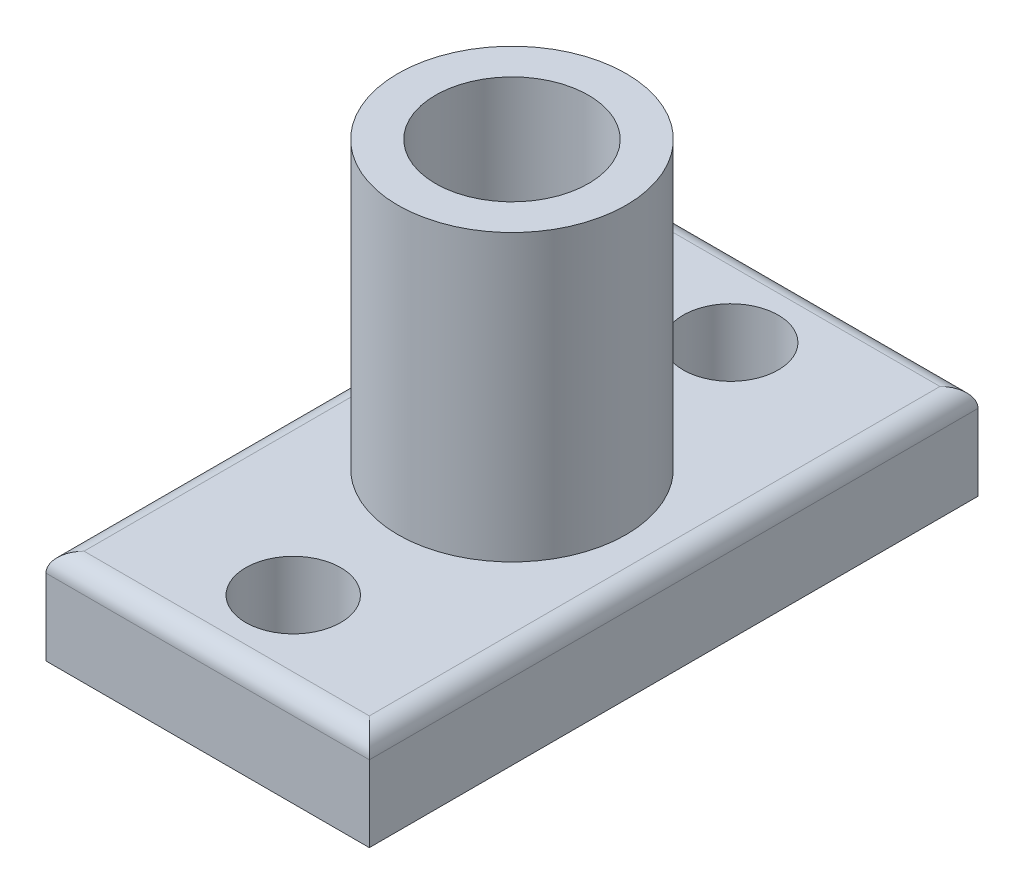
ISO-10303-21;
HEADER;
FILE_DESCRIPTION(('STEP AP214'),'2;1');
FILE_NAME('part.step','',(''),(''),'','','');
FILE_SCHEMA(('AUTOMOTIVE_DESIGN { 1 0 10303 214 1 1 1 1 }'));
ENDSEC;
DATA;
#1=APPLICATION_CONTEXT('core data for automotive mechanical design processes');
#2=APPLICATION_PROTOCOL_DEFINITION('international standard','automotive_design',2000,#1);
#3=PRODUCT_CONTEXT('',#1,'mechanical');
#4=PRODUCT('Part','Part','',(#3));
#5=PRODUCT_RELATED_PRODUCT_CATEGORY('part','',(#4));
#6=PRODUCT_DEFINITION_FORMATION('','',#4);
#7=PRODUCT_DEFINITION_CONTEXT('part definition',#1,'design');
#8=PRODUCT_DEFINITION('design','',#6,#7);
#9=PRODUCT_DEFINITION_SHAPE('','',#8);
#10=(LENGTH_UNIT() NAMED_UNIT(*) SI_UNIT(.MILLI.,.METRE.));
#11=(NAMED_UNIT(*) PLANE_ANGLE_UNIT() SI_UNIT($,.RADIAN.));
#12=(NAMED_UNIT(*) SI_UNIT($,.STERADIAN.) SOLID_ANGLE_UNIT());
#13=UNCERTAINTY_MEASURE_WITH_UNIT(LENGTH_MEASURE(1.E-05),#10,'distance_accuracy_value','');
#14=(GEOMETRIC_REPRESENTATION_CONTEXT(3) GLOBAL_UNCERTAINTY_ASSIGNED_CONTEXT((#13)) GLOBAL_UNIT_ASSIGNED_CONTEXT((#10,
#11,#12)) REPRESENTATION_CONTEXT('',''));
#15=CARTESIAN_POINT('',(0.,0.,0.));
#16=DIRECTION('',(0.,0.,1.));
#17=DIRECTION('',(1.,0.,0.));
#18=AXIS2_PLACEMENT_3D('',#15,#16,#17);
#19=CARTESIAN_POINT('',(0.,5.,0.));
#20=DIRECTION('',(0.,-1.,0.));
#21=DIRECTION('',(0.,0.,-1.));
#22=AXIS2_PLACEMENT_3D('',#19,#20,#21);
#23=PLANE('',#22);
#24=DIRECTION('',(-1.,0.,0.));
#25=VECTOR('',#24,1.);
#26=CARTESIAN_POINT('',(0.,5.,-15.));
#27=LINE('',#26,#25);
#28=CARTESIAN_POINT('',(7.5,5.,-15.));
#29=VERTEX_POINT('',#28);
#30=CARTESIAN_POINT('',(-7.5,5.,-15.));
#31=VERTEX_POINT('',#30);
#32=EDGE_CURVE('E150',#29,#31,#27,.T.);
#33=ORIENTED_EDGE('',*,*,#32,.T.);
#34=DIRECTION('',(0.,0.,1.));
#35=VECTOR('',#34,1.);
#36=CARTESIAN_POINT('',(-7.5,5.,0.));
#37=LINE('',#36,#35);
#38=CARTESIAN_POINT('',(-7.5,5.,15.));
#39=VERTEX_POINT('',#38);
#40=EDGE_CURVE('E154',#31,#39,#37,.T.);
#41=ORIENTED_EDGE('',*,*,#40,.T.);
#42=DIRECTION('',(1.,0.,0.));
#43=VECTOR('',#42,1.);
#44=CARTESIAN_POINT('',(0.,5.,15.));
#45=LINE('',#44,#43);
#46=CARTESIAN_POINT('',(7.5,5.,15.));
#47=VERTEX_POINT('',#46);
#48=EDGE_CURVE('E147',#39,#47,#45,.T.);
#49=ORIENTED_EDGE('',*,*,#48,.T.);
#50=DIRECTION('',(0.,0.,-1.));
#51=VECTOR('',#50,1.);
#52=CARTESIAN_POINT('',(7.5,5.,0.));
#53=LINE('',#52,#51);
#54=EDGE_CURVE('E144',#47,#29,#53,.T.);
#55=ORIENTED_EDGE('',*,*,#54,.T.);
#56=EDGE_LOOP('',(#33,#41,#49,#55));
#57=FACE_BOUND('',#56,.T.);
#58=CARTESIAN_POINT('',(0.,5.,0.));
#59=DIRECTION('',(0.,-1.,0.));
#60=DIRECTION('',(0.,0.,-1.));
#61=AXIS2_PLACEMENT_3D('',#58,#59,#60);
#62=CIRCLE('',#61,6.);
#63=CARTESIAN_POINT('',(0.,5.,-6.));
#64=VERTEX_POINT('',#63);
#65=EDGE_CURVE('E104',#64,#64,#62,.F.);
#66=ORIENTED_EDGE('',*,*,#65,.F.);
#67=EDGE_LOOP('',(#66));
#68=FACE_BOUND('',#67,.T.);
#69=CARTESIAN_POINT('',(0.,5.,-11.5));
#70=DIRECTION('',(0.,1.,0.));
#71=DIRECTION('',(0.,0.,1.));
#72=AXIS2_PLACEMENT_3D('',#69,#70,#71);
#73=CIRCLE('',#72,2.5);
#74=CARTESIAN_POINT('',(0.,5.,-9.));
#75=VERTEX_POINT('',#74);
#76=EDGE_CURVE('E121',#75,#75,#73,.T.);
#77=ORIENTED_EDGE('',*,*,#76,.F.);
#78=EDGE_LOOP('',(#77));
#79=FACE_BOUND('',#78,.T.);
#80=CARTESIAN_POINT('',(0.,5.,11.5));
#81=DIRECTION('',(0.,1.,0.));
#82=DIRECTION('',(0.,0.,1.));
#83=AXIS2_PLACEMENT_3D('',#80,#81,#82);
#84=CIRCLE('',#83,2.5);
#85=CARTESIAN_POINT('',(0.,5.,14.));
#86=VERTEX_POINT('',#85);
#87=EDGE_CURVE('E196',#86,#86,#84,.T.);
#88=ORIENTED_EDGE('',*,*,#87,.F.);
#89=EDGE_LOOP('',(#88));
#90=FACE_BOUND('',#89,.T.);
#91=ADVANCED_FACE('F39',(#57,#68,#79,#90),#23,.F.);
#92=CARTESIAN_POINT('',(0.,0.,0.));
#93=DIRECTION('',(0.,-1.,0.));
#94=DIRECTION('',(0.,0.,-1.));
#95=AXIS2_PLACEMENT_3D('',#92,#93,#94);
#96=PLANE('',#95);
#97=CARTESIAN_POINT('',(0.,0.,-11.5));
#98=DIRECTION('',(0.,1.,0.));
#99=DIRECTION('',(0.,0.,1.));
#100=AXIS2_PLACEMENT_3D('',#97,#98,#99);
#101=CIRCLE('',#100,2.5);
#102=CARTESIAN_POINT('',(0.,0.,-9.));
#103=VERTEX_POINT('',#102);
#104=EDGE_CURVE('E125',#103,#103,#101,.T.);
#105=ORIENTED_EDGE('',*,*,#104,.T.);
#106=EDGE_LOOP('',(#105));
#107=FACE_BOUND('',#106,.T.);
#108=DIRECTION('',(0.,0.,-1.));
#109=VECTOR('',#108,1.);
#110=CARTESIAN_POINT('',(8.5,0.,16.));
#111=LINE('',#110,#109);
#112=CARTESIAN_POINT('',(8.5,0.,16.));
#113=VERTEX_POINT('',#112);
#114=CARTESIAN_POINT('',(8.5,0.,-16.));
#115=VERTEX_POINT('',#114);
#116=EDGE_CURVE('E112',#113,#115,#111,.T.);
#117=ORIENTED_EDGE('',*,*,#116,.F.);
#118=DIRECTION('',(1.,0.,0.));
#119=VECTOR('',#118,1.);
#120=CARTESIAN_POINT('',(-8.5,0.,16.));
#121=LINE('',#120,#119);
#122=CARTESIAN_POINT('',(-8.5,0.,16.));
#123=VERTEX_POINT('',#122);
#124=EDGE_CURVE('E131',#123,#113,#121,.T.);
#125=ORIENTED_EDGE('',*,*,#124,.F.);
#126=DIRECTION('',(0.,0.,1.));
#127=VECTOR('',#126,1.);
#128=CARTESIAN_POINT('',(-8.5,0.,16.));
#129=LINE('',#128,#127);
#130=CARTESIAN_POINT('',(-8.5,0.,-16.));
#131=VERTEX_POINT('',#130);
#132=EDGE_CURVE('E114',#131,#123,#129,.T.);
#133=ORIENTED_EDGE('',*,*,#132,.F.);
#134=DIRECTION('',(-1.,0.,0.));
#135=VECTOR('',#134,1.);
#136=CARTESIAN_POINT('',(-8.5,0.,-16.));
#137=LINE('',#136,#135);
#138=EDGE_CURVE('E98',#115,#131,#137,.T.);
#139=ORIENTED_EDGE('',*,*,#138,.F.);
#140=EDGE_LOOP('',(#117,#125,#133,#139));
#141=FACE_BOUND('',#140,.T.);
#142=CARTESIAN_POINT('',(0.,0.,11.5));
#143=DIRECTION('',(0.,1.,0.));
#144=DIRECTION('',(0.,0.,1.));
#145=AXIS2_PLACEMENT_3D('',#142,#143,#144);
#146=CIRCLE('',#145,2.5);
#147=CARTESIAN_POINT('',(0.,0.,14.));
#148=VERTEX_POINT('',#147);
#149=EDGE_CURVE('E195',#148,#148,#146,.T.);
#150=ORIENTED_EDGE('',*,*,#149,.T.);
#151=EDGE_LOOP('',(#150));
#152=FACE_BOUND('',#151,.T.);
#153=ADVANCED_FACE('F109',(#107,#141,#152),#96,.T.);
#154=CARTESIAN_POINT('',(8.5,5.,16.));
#155=DIRECTION('',(-1.,0.,0.));
#156=DIRECTION('',(0.,0.,1.));
#157=AXIS2_PLACEMENT_3D('',#154,#155,#156);
#158=PLANE('',#157);
#159=DIRECTION('',(0.,-1.,0.));
#160=VECTOR('',#159,1.);
#161=CARTESIAN_POINT('',(8.5,5.,-16.));
#162=LINE('',#161,#160);
#163=CARTESIAN_POINT('',(8.5,4.,-16.));
#164=VERTEX_POINT('',#163);
#165=EDGE_CURVE('E94',#164,#115,#162,.T.);
#166=ORIENTED_EDGE('',*,*,#165,.F.);
#167=DIRECTION('',(0.,0.,-1.));
#168=VECTOR('',#167,1.);
#169=CARTESIAN_POINT('',(8.5,4.,16.));
#170=LINE('',#169,#168);
#171=CARTESIAN_POINT('',(8.5,4.,16.));
#172=VERTEX_POINT('',#171);
#173=EDGE_CURVE('E11',#164,#172,#170,.F.);
#174=ORIENTED_EDGE('',*,*,#173,.T.);
#175=DIRECTION('',(0.,-1.,0.));
#176=VECTOR('',#175,1.);
#177=CARTESIAN_POINT('',(8.5,5.,16.));
#178=LINE('',#177,#176);
#179=EDGE_CURVE('E118',#172,#113,#178,.T.);
#180=ORIENTED_EDGE('',*,*,#179,.T.);
#181=ORIENTED_EDGE('',*,*,#116,.T.);
#182=EDGE_LOOP('',(#166,#174,#180,#181));
#183=FACE_BOUND('',#182,.T.);
#184=ADVANCED_FACE('F117',(#183),#158,.F.);
#185=CARTESIAN_POINT('',(-8.5,5.,-16.));
#186=DIRECTION('',(0.,0.,1.));
#187=DIRECTION('',(1.,0.,0.));
#188=AXIS2_PLACEMENT_3D('',#185,#186,#187);
#189=PLANE('',#188);
#190=DIRECTION('',(0.,-1.,0.));
#191=VECTOR('',#190,1.);
#192=CARTESIAN_POINT('',(-8.5,5.,-16.));
#193=LINE('',#192,#191);
#194=CARTESIAN_POINT('',(-8.5,4.,-16.));
#195=VERTEX_POINT('',#194);
#196=EDGE_CURVE('E105',#195,#131,#193,.T.);
#197=ORIENTED_EDGE('',*,*,#196,.F.);
#198=DIRECTION('',(-1.,0.,0.));
#199=VECTOR('',#198,1.);
#200=CARTESIAN_POINT('',(-8.5,4.,-16.));
#201=LINE('',#200,#199);
#202=EDGE_CURVE('E101',#195,#164,#201,.F.);
#203=ORIENTED_EDGE('',*,*,#202,.T.);
#204=ORIENTED_EDGE('',*,*,#165,.T.);
#205=ORIENTED_EDGE('',*,*,#138,.T.);
#206=EDGE_LOOP('',(#197,#203,#204,#205));
#207=FACE_BOUND('',#206,.T.);
#208=ADVANCED_FACE('F97',(#207),#189,.F.);
#209=CARTESIAN_POINT('',(-8.5,5.,16.));
#210=DIRECTION('',(1.,0.,0.));
#211=DIRECTION('',(0.,0.,-1.));
#212=AXIS2_PLACEMENT_3D('',#209,#210,#211);
#213=PLANE('',#212);
#214=DIRECTION('',(0.,-1.,0.));
#215=VECTOR('',#214,1.);
#216=CARTESIAN_POINT('',(-8.5,5.,16.));
#217=LINE('',#216,#215);
#218=CARTESIAN_POINT('',(-8.5,4.,16.));
#219=VERTEX_POINT('',#218);
#220=EDGE_CURVE('E136',#219,#123,#217,.T.);
#221=ORIENTED_EDGE('',*,*,#220,.F.);
#222=DIRECTION('',(0.,0.,1.));
#223=VECTOR('',#222,1.);
#224=CARTESIAN_POINT('',(-8.5,4.,16.));
#225=LINE('',#224,#223);
#226=EDGE_CURVE('E49',#219,#195,#225,.F.);
#227=ORIENTED_EDGE('',*,*,#226,.T.);
#228=ORIENTED_EDGE('',*,*,#196,.T.);
#229=ORIENTED_EDGE('',*,*,#132,.T.);
#230=EDGE_LOOP('',(#221,#227,#228,#229));
#231=FACE_BOUND('',#230,.T.);
#232=ADVANCED_FACE('F299',(#231),#213,.F.);
#233=CARTESIAN_POINT('',(-8.5,5.,16.));
#234=DIRECTION('',(0.,0.,-1.));
#235=DIRECTION('',(-1.,0.,0.));
#236=AXIS2_PLACEMENT_3D('',#233,#234,#235);
#237=PLANE('',#236);
#238=ORIENTED_EDGE('',*,*,#179,.F.);
#239=DIRECTION('',(1.,0.,0.));
#240=VECTOR('',#239,1.);
#241=CARTESIAN_POINT('',(-8.5,4.,16.));
#242=LINE('',#241,#240);
#243=EDGE_CURVE('E57',#172,#219,#242,.F.);
#244=ORIENTED_EDGE('',*,*,#243,.T.);
#245=ORIENTED_EDGE('',*,*,#220,.T.);
#246=ORIENTED_EDGE('',*,*,#124,.T.);
#247=EDGE_LOOP('',(#238,#244,#245,#246));
#248=FACE_BOUND('',#247,.T.);
#249=ADVANCED_FACE('F217',(#248),#237,.F.);
#250=CARTESIAN_POINT('',(0.,5.,-11.5));
#251=DIRECTION('',(0.,-1.,0.));
#252=DIRECTION('',(0.,0.,-1.));
#253=AXIS2_PLACEMENT_3D('',#250,#251,#252);
#254=CYLINDRICAL_SURFACE('',#253,2.5);
#255=ORIENTED_EDGE('',*,*,#76,.T.);
#256=EDGE_LOOP('',(#255));
#257=FACE_BOUND('',#256,.T.);
#258=ORIENTED_EDGE('',*,*,#104,.F.);
#259=EDGE_LOOP('',(#258));
#260=FACE_BOUND('',#259,.T.);
#261=ADVANCED_FACE('F207',(#257,#260),#254,.F.);
#262=CARTESIAN_POINT('',(0.,5.,11.5));
#263=DIRECTION('',(0.,-1.,0.));
#264=DIRECTION('',(0.,0.,-1.));
#265=AXIS2_PLACEMENT_3D('',#262,#263,#264);
#266=CYLINDRICAL_SURFACE('',#265,2.5);
#267=ORIENTED_EDGE('',*,*,#87,.T.);
#268=EDGE_LOOP('',(#267));
#269=FACE_BOUND('',#268,.T.);
#270=ORIENTED_EDGE('',*,*,#149,.F.);
#271=EDGE_LOOP('',(#270));
#272=FACE_BOUND('',#271,.T.);
#273=ADVANCED_FACE('F204',(#269,#272),#266,.F.);
#274=CARTESIAN_POINT('',(0.,20.,0.));
#275=DIRECTION('',(0.,1.,0.));
#276=DIRECTION('',(0.,0.,1.));
#277=AXIS2_PLACEMENT_3D('',#274,#275,#276);
#278=PLANE('',#277);
#279=CARTESIAN_POINT('',(0.,20.,0.));
#280=DIRECTION('',(0.,1.,0.));
#281=DIRECTION('',(0.,0.,1.));
#282=AXIS2_PLACEMENT_3D('',#279,#280,#281);
#283=CIRCLE('',#282,6.);
#284=CARTESIAN_POINT('',(0.,20.,6.));
#285=VERTEX_POINT('',#284);
#286=EDGE_CURVE('E189',#285,#285,#283,.T.);
#287=ORIENTED_EDGE('',*,*,#286,.T.);
#288=EDGE_LOOP('',(#287));
#289=FACE_BOUND('',#288,.T.);
#290=CARTESIAN_POINT('',(0.,20.,0.));
#291=DIRECTION('',(0.,1.,0.));
#292=DIRECTION('',(0.,0.,1.));
#293=AXIS2_PLACEMENT_3D('',#290,#291,#292);
#294=CIRCLE('',#293,4.025);
#295=CARTESIAN_POINT('',(0.,20.,4.025));
#296=VERTEX_POINT('',#295);
#297=EDGE_CURVE('E183',#296,#296,#294,.T.);
#298=ORIENTED_EDGE('',*,*,#297,.F.);
#299=EDGE_LOOP('',(#298));
#300=FACE_BOUND('',#299,.T.);
#301=ADVANCED_FACE('F206',(#289,#300),#278,.T.);
#302=CARTESIAN_POINT('',(0.,20.,0.));
#303=DIRECTION('',(0.,-1.,0.));
#304=DIRECTION('',(0.,0.,-1.));
#305=AXIS2_PLACEMENT_3D('',#302,#303,#304);
#306=CYLINDRICAL_SURFACE('',#305,6.);
#307=ORIENTED_EDGE('',*,*,#286,.F.);
#308=EDGE_LOOP('',(#307));
#309=FACE_BOUND('',#308,.T.);
#310=ORIENTED_EDGE('',*,*,#65,.T.);
#311=EDGE_LOOP('',(#310));
#312=FACE_BOUND('',#311,.T.);
#313=ADVANCED_FACE('F214',(#309,#312),#306,.T.);
#314=CARTESIAN_POINT('',(0.,20.,0.));
#315=DIRECTION('',(0.,-1.,0.));
#316=DIRECTION('',(0.,0.,-1.));
#317=AXIS2_PLACEMENT_3D('',#314,#315,#316);
#318=CYLINDRICAL_SURFACE('',#317,4.025);
#319=ORIENTED_EDGE('',*,*,#297,.T.);
#320=EDGE_LOOP('',(#319));
#321=FACE_BOUND('',#320,.T.);
#322=CARTESIAN_POINT('',(0.,5.,0.));
#323=DIRECTION('',(0.,1.,0.));
#324=DIRECTION('',(0.,0.,1.));
#325=AXIS2_PLACEMENT_3D('',#322,#323,#324);
#326=CIRCLE('',#325,4.025);
#327=CARTESIAN_POINT('',(0.,5.,4.025));
#328=VERTEX_POINT('',#327);
#329=EDGE_CURVE('E177',#328,#328,#326,.T.);
#330=ORIENTED_EDGE('',*,*,#329,.F.);
#331=EDGE_LOOP('',(#330));
#332=FACE_BOUND('',#331,.T.);
#333=ADVANCED_FACE('F232',(#321,#332),#318,.F.);
#334=ORIENTED_EDGE('',*,*,#329,.T.);
#335=EDGE_LOOP('',(#334));
#336=FACE_BOUND('',#335,.T.);
#337=ADVANCED_FACE('F224',(#336),#23,.F.);
#338=CARTESIAN_POINT('',(0.,4.,15.));
#339=DIRECTION('',(1.,0.,0.));
#340=DIRECTION('',(0.,0.,-1.));
#341=AXIS2_PLACEMENT_3D('',#338,#339,#340);
#342=CYLINDRICAL_SURFACE('',#341,1.);
#343=CARTESIAN_POINT('',(-7.5,4.,15.));
#344=DIRECTION('',(0.707106781186547,0.,0.707106781186547));
#345=DIRECTION('',(-0.707106781186547,0.,0.707106781186547));
#346=AXIS2_PLACEMENT_3D('',#343,#344,#345);
#347=ELLIPSE('',#346,1.41421356237309,1.);
#348=EDGE_CURVE('E168',#219,#39,#347,.F.);
#349=ORIENTED_EDGE('',*,*,#348,.F.);
#350=ORIENTED_EDGE('',*,*,#243,.F.);
#351=CARTESIAN_POINT('',(7.5,4.,15.));
#352=DIRECTION('',(0.707106781186547,0.,-0.707106781186547));
#353=DIRECTION('',(-0.707106781186547,0.,-0.707106781186547));
#354=AXIS2_PLACEMENT_3D('',#351,#352,#353);
#355=ELLIPSE('',#354,1.41421356237309,1.);
#356=EDGE_CURVE('E43',#47,#172,#355,.T.);
#357=ORIENTED_EDGE('',*,*,#356,.F.);
#358=ORIENTED_EDGE('',*,*,#48,.F.);
#359=EDGE_LOOP('',(#349,#350,#357,#358));
#360=FACE_BOUND('',#359,.T.);
#361=ADVANCED_FACE('F41',(#360),#342,.T.);
#362=CARTESIAN_POINT('',(7.5,4.,0.));
#363=DIRECTION('',(0.,0.,-1.));
#364=DIRECTION('',(-1.,0.,0.));
#365=AXIS2_PLACEMENT_3D('',#362,#363,#364);
#366=CYLINDRICAL_SURFACE('',#365,1.);
#367=ORIENTED_EDGE('',*,*,#356,.T.);
#368=ORIENTED_EDGE('',*,*,#173,.F.);
#369=CARTESIAN_POINT('',(7.5,4.,-15.));
#370=DIRECTION('',(-0.707106781186547,0.,-0.707106781186547));
#371=DIRECTION('',(0.707106781186547,0.,-0.707106781186547));
#372=AXIS2_PLACEMENT_3D('',#369,#370,#371);
#373=ELLIPSE('',#372,1.41421356237309,1.);
#374=EDGE_CURVE('E166',#29,#164,#373,.T.);
#375=ORIENTED_EDGE('',*,*,#374,.F.);
#376=ORIENTED_EDGE('',*,*,#54,.F.);
#377=EDGE_LOOP('',(#367,#368,#375,#376));
#378=FACE_BOUND('',#377,.T.);
#379=ADVANCED_FACE('F237',(#378),#366,.T.);
#380=CARTESIAN_POINT('',(-7.5,4.,0.));
#381=DIRECTION('',(0.,0.,1.));
#382=DIRECTION('',(1.,0.,0.));
#383=AXIS2_PLACEMENT_3D('',#380,#381,#382);
#384=CYLINDRICAL_SURFACE('',#383,1.);
#385=ORIENTED_EDGE('',*,*,#348,.T.);
#386=ORIENTED_EDGE('',*,*,#40,.F.);
#387=CARTESIAN_POINT('',(-7.5,4.,-15.));
#388=DIRECTION('',(-0.707106781186547,0.,0.707106781186547));
#389=DIRECTION('',(0.707106781186547,0.,0.707106781186547));
#390=AXIS2_PLACEMENT_3D('',#387,#388,#389);
#391=ELLIPSE('',#390,1.41421356237309,1.);
#392=EDGE_CURVE('E163',#195,#31,#391,.F.);
#393=ORIENTED_EDGE('',*,*,#392,.F.);
#394=ORIENTED_EDGE('',*,*,#226,.F.);
#395=EDGE_LOOP('',(#385,#386,#393,#394));
#396=FACE_BOUND('',#395,.T.);
#397=ADVANCED_FACE('F327',(#396),#384,.T.);
#398=CARTESIAN_POINT('',(0.,4.,-15.));
#399=DIRECTION('',(-1.,0.,0.));
#400=DIRECTION('',(0.,0.,1.));
#401=AXIS2_PLACEMENT_3D('',#398,#399,#400);
#402=CYLINDRICAL_SURFACE('',#401,1.);
#403=ORIENTED_EDGE('',*,*,#374,.T.);
#404=ORIENTED_EDGE('',*,*,#202,.F.);
#405=ORIENTED_EDGE('',*,*,#392,.T.);
#406=ORIENTED_EDGE('',*,*,#32,.F.);
#407=EDGE_LOOP('',(#403,#404,#405,#406));
#408=FACE_BOUND('',#407,.T.);
#409=ADVANCED_FACE('F335',(#408),#402,.T.);
#410=CLOSED_SHELL('',(#91,#153,#184,#208,#232,#249,#261,#273,#301,#313,#333,#337,#361,#379,#397,#409));
#411=MANIFOLD_SOLID_BREP('B2',#410);
#412=ADVANCED_BREP_SHAPE_REPRESENTATION('',(#18,#411),#14);
#413=SHAPE_DEFINITION_REPRESENTATION(#9,#412);
ENDSEC;
END-ISO-10303-21;
